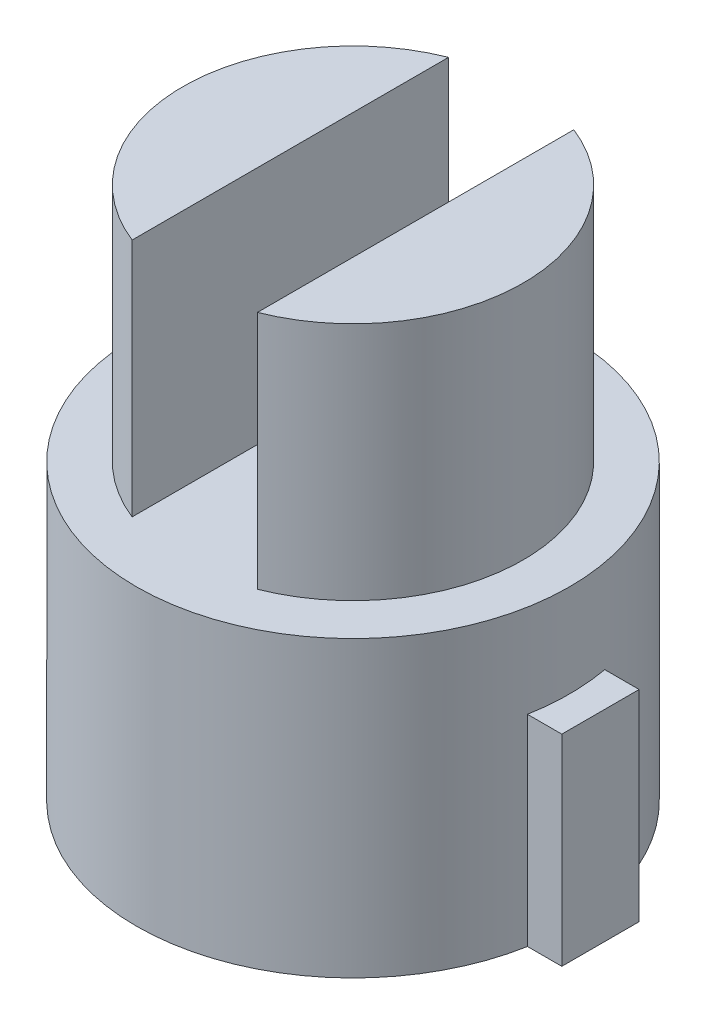
ISO-10303-21;
HEADER;
FILE_DESCRIPTION(('STEP AP214'),'2;1');
FILE_NAME('part.step','',(''),(''),'','','');
FILE_SCHEMA(('AUTOMOTIVE_DESIGN { 1 0 10303 214 1 1 1 1 }'));
ENDSEC;
DATA;
#1=APPLICATION_CONTEXT('core data for automotive mechanical design processes');
#2=APPLICATION_PROTOCOL_DEFINITION('international standard','automotive_design',2000,#1);
#3=PRODUCT_CONTEXT('',#1,'mechanical');
#4=PRODUCT('Part','Part','',(#3));
#5=PRODUCT_RELATED_PRODUCT_CATEGORY('part','',(#4));
#6=PRODUCT_DEFINITION_FORMATION('','',#4);
#7=PRODUCT_DEFINITION_CONTEXT('part definition',#1,'design');
#8=PRODUCT_DEFINITION('design','',#6,#7);
#9=PRODUCT_DEFINITION_SHAPE('','',#8);
#10=(LENGTH_UNIT() NAMED_UNIT(*) SI_UNIT(.MILLI.,.METRE.));
#11=(NAMED_UNIT(*) PLANE_ANGLE_UNIT() SI_UNIT($,.RADIAN.));
#12=(NAMED_UNIT(*) SI_UNIT($,.STERADIAN.) SOLID_ANGLE_UNIT());
#13=UNCERTAINTY_MEASURE_WITH_UNIT(LENGTH_MEASURE(1.E-05),#10,'distance_accuracy_value','');
#14=(GEOMETRIC_REPRESENTATION_CONTEXT(3) GLOBAL_UNCERTAINTY_ASSIGNED_CONTEXT((#13)) GLOBAL_UNIT_ASSIGNED_CONTEXT((#10,
#11,#12)) REPRESENTATION_CONTEXT('',''));
#15=CARTESIAN_POINT('',(0.,0.,0.));
#16=DIRECTION('',(0.,0.,1.));
#17=DIRECTION('',(1.,0.,0.));
#18=AXIS2_PLACEMENT_3D('',#15,#16,#17);
#19=CARTESIAN_POINT('',(0.,19.,0.));
#20=DIRECTION('',(0.,-1.,0.));
#21=DIRECTION('',(0.,0.,-1.));
#22=AXIS2_PLACEMENT_3D('',#19,#20,#21);
#23=CYLINDRICAL_SURFACE('',#22,14.);
#24=CARTESIAN_POINT('',(0.,19.,0.));
#25=DIRECTION('',(0.,1.,0.));
#26=DIRECTION('',(0.,0.,1.));
#27=AXIS2_PLACEMENT_3D('',#24,#25,#26);
#28=CIRCLE('',#27,14.);
#29=CARTESIAN_POINT('',(0.,19.,14.));
#30=VERTEX_POINT('',#29);
#31=EDGE_CURVE('E236',#30,#30,#28,.T.);
#32=ORIENTED_EDGE('',*,*,#31,.F.);
#33=EDGE_LOOP('',(#32));
#34=FACE_BOUND('',#33,.T.);
#35=DIRECTION('',(0.,-1.,0.));
#36=VECTOR('',#35,1.);
#37=CARTESIAN_POINT('',(13.7752957501457,13.,2.49824478304639));
#38=LINE('',#37,#36);
#39=CARTESIAN_POINT('',(13.7752957501457,13.,2.49824478304639));
#40=VERTEX_POINT('',#39);
#41=CARTESIAN_POINT('',(13.7752957501457,0.,2.49824478304639));
#42=VERTEX_POINT('',#41);
#43=EDGE_CURVE('E65',#40,#42,#38,.T.);
#44=ORIENTED_EDGE('',*,*,#43,.F.);
#45=CARTESIAN_POINT('',(0.,13.,0.));
#46=DIRECTION('',(0.,1.,0.));
#47=DIRECTION('',(0.,0.,1.));
#48=AXIS2_PLACEMENT_3D('',#45,#46,#47);
#49=CIRCLE('',#48,14.);
#50=CARTESIAN_POINT('',(13.7749773139559,13.,-2.5));
#51=VERTEX_POINT('',#50);
#52=EDGE_CURVE('E60',#40,#51,#49,.T.);
#53=ORIENTED_EDGE('',*,*,#52,.T.);
#54=DIRECTION('',(0.,-1.,0.));
#55=VECTOR('',#54,1.);
#56=CARTESIAN_POINT('',(13.7749773139559,13.,-2.5));
#57=LINE('',#56,#55);
#58=CARTESIAN_POINT('',(13.7749773139559,0.,-2.5));
#59=VERTEX_POINT('',#58);
#60=EDGE_CURVE('E173',#51,#59,#57,.T.);
#61=ORIENTED_EDGE('',*,*,#60,.T.);
#62=CARTESIAN_POINT('',(0.,0.,0.));
#63=DIRECTION('',(0.,1.,0.));
#64=DIRECTION('',(0.,0.,1.));
#65=AXIS2_PLACEMENT_3D('',#62,#63,#64);
#66=CIRCLE('',#65,14.);
#67=CARTESIAN_POINT('',(-13.7746586467486,0.,-2.50175521695361));
#68=VERTEX_POINT('',#67);
#69=EDGE_CURVE('E226',#59,#68,#66,.T.);
#70=ORIENTED_EDGE('',*,*,#69,.T.);
#71=DIRECTION('',(0.,-1.,0.));
#72=VECTOR('',#71,1.);
#73=CARTESIAN_POINT('',(-13.7746586467486,13.,-2.50175521695361));
#74=LINE('',#73,#72);
#75=CARTESIAN_POINT('',(-13.7746586467486,13.,-2.50175521695361));
#76=VERTEX_POINT('',#75);
#77=EDGE_CURVE('E212',#76,#68,#74,.T.);
#78=ORIENTED_EDGE('',*,*,#77,.F.);
#79=CARTESIAN_POINT('',(0.,13.,0.));
#80=DIRECTION('',(0.,1.,0.));
#81=DIRECTION('',(0.,0.,1.));
#82=AXIS2_PLACEMENT_3D('',#79,#80,#81);
#83=CIRCLE('',#82,14.);
#84=CARTESIAN_POINT('',(-13.7752957501457,13.,2.49824478304639));
#85=VERTEX_POINT('',#84);
#86=EDGE_CURVE('E187',#76,#85,#83,.T.);
#87=ORIENTED_EDGE('',*,*,#86,.T.);
#88=DIRECTION('',(0.,-1.,0.));
#89=VECTOR('',#88,1.);
#90=CARTESIAN_POINT('',(-13.7752957501457,13.,2.49824478304639));
#91=LINE('',#90,#89);
#92=CARTESIAN_POINT('',(-13.7752957501457,0.,2.49824478304639));
#93=VERTEX_POINT('',#92);
#94=EDGE_CURVE('E198',#85,#93,#91,.T.);
#95=ORIENTED_EDGE('',*,*,#94,.T.);
#96=EDGE_CURVE('E246',#93,#42,#66,.T.);
#97=ORIENTED_EDGE('',*,*,#96,.T.);
#98=EDGE_LOOP('',(#44,#53,#61,#70,#78,#87,#95,#97));
#99=FACE_BOUND('',#98,.T.);
#100=ADVANCED_FACE('F45',(#34,#99),#23,.T.);
#101=CARTESIAN_POINT('',(-4.05085374094877,34.5,0.));
#102=DIRECTION('',(1.,0.,0.));
#103=DIRECTION('',(0.,0.,-1.));
#104=AXIS2_PLACEMENT_3D('',#101,#102,#103);
#105=PLANE('',#104);
#106=DIRECTION('',(0.,0.,1.));
#107=VECTOR('',#106,1.);
#108=CARTESIAN_POINT('',(-4.05085374094877,19.,0.));
#109=LINE('',#108,#107);
#110=CARTESIAN_POINT('',(-4.05085374094877,19.,-10.2269534886764));
#111=VERTEX_POINT('',#110);
#112=CARTESIAN_POINT('',(-4.05085374094877,19.,10.2201362771462));
#113=VERTEX_POINT('',#112);
#114=EDGE_CURVE('E240',#111,#113,#109,.T.);
#115=ORIENTED_EDGE('',*,*,#114,.F.);
#116=DIRECTION('',(0.,-1.,0.));
#117=VECTOR('',#116,1.);
#118=CARTESIAN_POINT('',(-4.05085374094877,34.5,-10.2269534886764));
#119=LINE('',#118,#117);
#120=CARTESIAN_POINT('',(-4.05085374094877,34.5,-10.2269534886764));
#121=VERTEX_POINT('',#120);
#122=EDGE_CURVE('E11',#121,#111,#119,.T.);
#123=ORIENTED_EDGE('',*,*,#122,.F.);
#124=DIRECTION('',(0.,0.,1.));
#125=VECTOR('',#124,1.);
#126=CARTESIAN_POINT('',(-4.05085374094877,34.5,0.));
#127=LINE('',#126,#125);
#128=CARTESIAN_POINT('',(-4.05085374094877,34.5,10.2201362771462));
#129=VERTEX_POINT('',#128);
#130=EDGE_CURVE('E258',#121,#129,#127,.T.);
#131=ORIENTED_EDGE('',*,*,#130,.T.);
#132=DIRECTION('',(0.,-1.,0.));
#133=VECTOR('',#132,1.);
#134=CARTESIAN_POINT('',(-4.05085374094877,34.5,10.2201362771462));
#135=LINE('',#134,#133);
#136=EDGE_CURVE('E266',#129,#113,#135,.T.);
#137=ORIENTED_EDGE('',*,*,#136,.T.);
#138=EDGE_LOOP('',(#115,#123,#131,#137));
#139=FACE_BOUND('',#138,.T.);
#140=ADVANCED_FACE('F47',(#139),#105,.T.);
#141=CARTESIAN_POINT('',(0.,34.5,0.));
#142=DIRECTION('',(0.,-1.,0.));
#143=DIRECTION('',(0.,0.,-1.));
#144=AXIS2_PLACEMENT_3D('',#141,#142,#143);
#145=CYLINDRICAL_SURFACE('',#144,10.9999997131868);
#146=ORIENTED_EDGE('',*,*,#122,.T.);
#147=CARTESIAN_POINT('',(0.,19.,0.));
#148=DIRECTION('',(0.,1.,0.));
#149=DIRECTION('',(0.,0.,1.));
#150=AXIS2_PLACEMENT_3D('',#147,#148,#149);
#151=CIRCLE('',#150,10.9999997131868);
#152=CARTESIAN_POINT('',(-4.05318905300909,19.,10.2260281727891));
#153=VERTEX_POINT('',#152);
#154=EDGE_CURVE('E233',#111,#153,#151,.T.);
#155=ORIENTED_EDGE('',*,*,#154,.T.);
#156=DIRECTION('',(0.,-1.,0.));
#157=VECTOR('',#156,1.);
#158=CARTESIAN_POINT('',(-4.05318905300909,34.5,10.2260281727891));
#159=LINE('',#158,#157);
#160=CARTESIAN_POINT('',(-4.05318905300909,34.5,10.2260281727891));
#161=VERTEX_POINT('',#160);
#162=EDGE_CURVE('E53',#161,#153,#159,.T.);
#163=ORIENTED_EDGE('',*,*,#162,.F.);
#164=CARTESIAN_POINT('',(0.,34.5,0.));
#165=DIRECTION('',(0.,1.,0.));
#166=DIRECTION('',(0.,0.,1.));
#167=AXIS2_PLACEMENT_3D('',#164,#165,#166);
#168=CIRCLE('',#167,10.9999997131868);
#169=EDGE_CURVE('E261',#121,#161,#168,.T.);
#170=ORIENTED_EDGE('',*,*,#169,.F.);
#171=EDGE_LOOP('',(#146,#155,#163,#170));
#172=FACE_BOUND('',#171,.T.);
#173=ADVANCED_FACE('F287',(#172),#145,.T.);
#174=CARTESIAN_POINT('',(-6.49904603158947E-13,34.5,-2.57596221965533E-13));
#175=DIRECTION('',(0.929638949038373,0.,0.368471741699183));
#176=DIRECTION('',(0.368471741699183,0.,-0.929638949038373));
#177=AXIS2_PLACEMENT_3D('',#174,#175,#176);
#178=PLANE('',#177);
#179=DIRECTION('',(-0.368471741699183,0.,0.929638949038373));
#180=VECTOR('',#179,1.);
#181=CARTESIAN_POINT('',(-6.49904603158947E-13,0.,-2.57596221965533E-13));
#182=LINE('',#181,#180);
#183=CARTESIAN_POINT('',(-4.05085374094877,0.,10.2201362771462));
#184=VERTEX_POINT('',#183);
#185=CARTESIAN_POINT('',(-4.05318905300909,0.,10.2260281727891));
#186=VERTEX_POINT('',#185);
#187=EDGE_CURVE('E257',#184,#186,#182,.T.);
#188=ORIENTED_EDGE('',*,*,#187,.F.);
#189=DIRECTION('',(0.,1.,0.));
#190=VECTOR('',#189,1.);
#191=CARTESIAN_POINT('',(-4.05085374094877,34.5,10.2201362771462));
#192=LINE('',#191,#190);
#193=EDGE_CURVE('E255',#184,#113,#192,.T.);
#194=ORIENTED_EDGE('',*,*,#193,.T.);
#195=ORIENTED_EDGE('',*,*,#136,.F.);
#196=DIRECTION('',(-0.368471741699183,0.,0.929638949038373));
#197=VECTOR('',#196,1.);
#198=CARTESIAN_POINT('',(-6.49904603158947E-13,34.5,-2.57596221965533E-13));
#199=LINE('',#198,#197);
#200=EDGE_CURVE('E263',#129,#161,#199,.T.);
#201=ORIENTED_EDGE('',*,*,#200,.T.);
#202=ORIENTED_EDGE('',*,*,#162,.T.);
#203=DIRECTION('',(0.,-1.,0.));
#204=VECTOR('',#203,1.);
#205=CARTESIAN_POINT('',(-4.05318905300909,19.,10.2260281727891));
#206=LINE('',#205,#204);
#207=EDGE_CURVE('E252',#186,#153,#206,.F.);
#208=ORIENTED_EDGE('',*,*,#207,.F.);
#209=EDGE_LOOP('',(#188,#194,#195,#201,#202,#208));
#210=FACE_BOUND('',#209,.T.);
#211=ADVANCED_FACE('F273',(#210),#178,.T.);
#212=CARTESIAN_POINT('',(0.,34.5,0.));
#213=DIRECTION('',(0.,1.,0.));
#214=DIRECTION('',(0.,0.,1.));
#215=AXIS2_PLACEMENT_3D('',#212,#213,#214);
#216=PLANE('',#215);
#217=ORIENTED_EDGE('',*,*,#130,.F.);
#218=ORIENTED_EDGE('',*,*,#169,.T.);
#219=ORIENTED_EDGE('',*,*,#200,.F.);
#220=EDGE_LOOP('',(#217,#218,#219));
#221=FACE_BOUND('',#220,.T.);
#222=ADVANCED_FACE('F298',(#221),#216,.T.);
#223=CARTESIAN_POINT('',(0.,0.,0.));
#224=DIRECTION('',(0.,1.,0.));
#225=DIRECTION('',(0.,0.,1.));
#226=AXIS2_PLACEMENT_3D('',#223,#224,#225);
#227=PLANE('',#226);
#228=DIRECTION('',(0.,0.,1.));
#229=VECTOR('',#228,1.);
#230=CARTESIAN_POINT('',(-4.05085374094877,0.,0.));
#231=LINE('',#230,#229);
#232=CARTESIAN_POINT('',(-4.05085374094877,0.,10.2269534886764));
#233=VERTEX_POINT('',#232);
#234=EDGE_CURVE('E245',#184,#233,#231,.T.);
#235=ORIENTED_EDGE('',*,*,#234,.F.);
#236=ORIENTED_EDGE('',*,*,#187,.T.);
#237=CARTESIAN_POINT('',(0.,0.,0.));
#238=DIRECTION('',(0.,1.,0.));
#239=DIRECTION('',(0.,0.,1.));
#240=AXIS2_PLACEMENT_3D('',#237,#238,#239);
#241=CIRCLE('',#240,10.9999997131868);
#242=EDGE_CURVE('E231',#186,#233,#241,.T.);
#243=ORIENTED_EDGE('',*,*,#242,.T.);
#244=EDGE_LOOP('',(#235,#236,#243));
#245=FACE_BOUND('',#244,.T.);
#246=ORIENTED_EDGE('',*,*,#96,.F.);
#247=DIRECTION('',(-1.,0.,0.));
#248=VECTOR('',#247,1.);
#249=CARTESIAN_POINT('',(0.,0.,2.49824478304639));
#250=LINE('',#249,#248);
#251=CARTESIAN_POINT('',(-16.,0.,2.49824478304639));
#252=VERTEX_POINT('',#251);
#253=EDGE_CURVE('E190',#93,#252,#250,.T.);
#254=ORIENTED_EDGE('',*,*,#253,.T.);
#255=DIRECTION('',(0.,0.,-1.));
#256=VECTOR('',#255,1.);
#257=CARTESIAN_POINT('',(-16.,0.,0.));
#258=LINE('',#257,#256);
#259=CARTESIAN_POINT('',(-16.,0.,-2.50175521695361));
#260=VERTEX_POINT('',#259);
#261=EDGE_CURVE('E201',#252,#260,#258,.T.);
#262=ORIENTED_EDGE('',*,*,#261,.T.);
#263=DIRECTION('',(-1.,0.,0.));
#264=VECTOR('',#263,1.);
#265=CARTESIAN_POINT('',(0.,0.,-2.50175521695361));
#266=LINE('',#265,#264);
#267=EDGE_CURVE('E186',#68,#260,#266,.T.);
#268=ORIENTED_EDGE('',*,*,#267,.F.);
#269=ORIENTED_EDGE('',*,*,#69,.F.);
#270=DIRECTION('',(1.,0.,0.));
#271=VECTOR('',#270,1.);
#272=CARTESIAN_POINT('',(0.,0.,-2.5));
#273=LINE('',#272,#271);
#274=CARTESIAN_POINT('',(15.9953222609992,0.,-2.5));
#275=VERTEX_POINT('',#274);
#276=EDGE_CURVE('E180',#59,#275,#273,.T.);
#277=ORIENTED_EDGE('',*,*,#276,.T.);
#278=DIRECTION('',(0.,0.,-1.));
#279=VECTOR('',#278,1.);
#280=CARTESIAN_POINT('',(15.9953222609992,0.,0.));
#281=LINE('',#280,#279);
#282=CARTESIAN_POINT('',(15.9953222609992,0.,2.49824478304639));
#283=VERTEX_POINT('',#282);
#284=EDGE_CURVE('E178',#283,#275,#281,.T.);
#285=ORIENTED_EDGE('',*,*,#284,.F.);
#286=DIRECTION('',(1.,0.,0.));
#287=VECTOR('',#286,1.);
#288=CARTESIAN_POINT('',(0.,0.,2.49824478304639));
#289=LINE('',#288,#287);
#290=EDGE_CURVE('E163',#42,#283,#289,.T.);
#291=ORIENTED_EDGE('',*,*,#290,.F.);
#292=EDGE_LOOP('',(#246,#254,#262,#268,#269,#277,#285,#291));
#293=FACE_BOUND('',#292,.T.);
#294=ADVANCED_FACE('F295',(#245,#293),#227,.F.);
#295=CARTESIAN_POINT('',(-4.05085374094877,19.,0.));
#296=DIRECTION('',(1.,0.,0.));
#297=DIRECTION('',(0.,0.,-1.));
#298=AXIS2_PLACEMENT_3D('',#295,#296,#297);
#299=PLANE('',#298);
#300=ORIENTED_EDGE('',*,*,#193,.F.);
#301=ORIENTED_EDGE('',*,*,#234,.T.);
#302=DIRECTION('',(0.,-1.,0.));
#303=VECTOR('',#302,1.);
#304=CARTESIAN_POINT('',(-4.05085374094877,19.,10.2269534886764));
#305=LINE('',#304,#303);
#306=CARTESIAN_POINT('',(-4.05085374094877,19.,10.2269534886764));
#307=VERTEX_POINT('',#306);
#308=EDGE_CURVE('E249',#307,#233,#305,.T.);
#309=ORIENTED_EDGE('',*,*,#308,.F.);
#310=EDGE_CURVE('E239',#113,#307,#109,.T.);
#311=ORIENTED_EDGE('',*,*,#310,.F.);
#312=EDGE_LOOP('',(#300,#301,#309,#311));
#313=FACE_BOUND('',#312,.T.);
#314=ADVANCED_FACE('F292',(#313),#299,.F.);
#315=CARTESIAN_POINT('',(0.,19.,0.));
#316=DIRECTION('',(0.,-1.,0.));
#317=DIRECTION('',(0.,0.,-1.));
#318=AXIS2_PLACEMENT_3D('',#315,#316,#317);
#319=CYLINDRICAL_SURFACE('',#318,10.9999997131868);
#320=ORIENTED_EDGE('',*,*,#242,.F.);
#321=ORIENTED_EDGE('',*,*,#207,.T.);
#322=EDGE_CURVE('E232',#153,#307,#151,.T.);
#323=ORIENTED_EDGE('',*,*,#322,.T.);
#324=ORIENTED_EDGE('',*,*,#308,.T.);
#325=EDGE_LOOP('',(#320,#321,#323,#324));
#326=FACE_BOUND('',#325,.T.);
#327=ADVANCED_FACE('F281',(#326),#319,.F.);
#328=CARTESIAN_POINT('',(0.,19.,0.));
#329=DIRECTION('',(0.,1.,0.));
#330=DIRECTION('',(0.,0.,1.));
#331=AXIS2_PLACEMENT_3D('',#328,#329,#330);
#332=PLANE('',#331);
#333=CARTESIAN_POINT('',(4.05085374094877,19.,10.2269534886764));
#334=VERTEX_POINT('',#333);
#335=CARTESIAN_POINT('',(4.05085374094877,19.,-10.2269534886764));
#336=VERTEX_POINT('',#335);
#337=EDGE_CURVE('E227',#334,#336,#151,.T.);
#338=ORIENTED_EDGE('',*,*,#337,.F.);
#339=DIRECTION('',(0.,0.,1.));
#340=VECTOR('',#339,1.);
#341=CARTESIAN_POINT('',(4.05085374094877,19.,0.));
#342=LINE('',#341,#340);
#343=EDGE_CURVE('E230',#336,#334,#342,.T.);
#344=ORIENTED_EDGE('',*,*,#343,.F.);
#345=EDGE_LOOP('',(#338,#344));
#346=FACE_BOUND('',#345,.T.);
#347=ORIENTED_EDGE('',*,*,#31,.T.);
#348=EDGE_LOOP('',(#347));
#349=FACE_BOUND('',#348,.T.);
#350=ORIENTED_EDGE('',*,*,#114,.T.);
#351=ORIENTED_EDGE('',*,*,#310,.T.);
#352=ORIENTED_EDGE('',*,*,#322,.F.);
#353=ORIENTED_EDGE('',*,*,#154,.F.);
#354=EDGE_LOOP('',(#350,#351,#352,#353));
#355=FACE_BOUND('',#354,.T.);
#356=ADVANCED_FACE('F285',(#346,#349,#355),#332,.T.);
#357=CARTESIAN_POINT('',(0.,34.5,0.));
#358=DIRECTION('',(0.,1.,0.));
#359=DIRECTION('',(0.,0.,1.));
#360=AXIS2_PLACEMENT_3D('',#357,#358,#359);
#361=PLANE('',#360);
#362=DIRECTION('',(0.,0.,1.));
#363=VECTOR('',#362,1.);
#364=CARTESIAN_POINT('',(4.05085374094877,34.5,0.));
#365=LINE('',#364,#363);
#366=CARTESIAN_POINT('',(4.05085374094877,34.5,-10.2269534886764));
#367=VERTEX_POINT('',#366);
#368=CARTESIAN_POINT('',(4.05085374094877,34.5,10.2269534886764));
#369=VERTEX_POINT('',#368);
#370=EDGE_CURVE('E215',#367,#369,#365,.T.);
#371=ORIENTED_EDGE('',*,*,#370,.T.);
#372=CARTESIAN_POINT('',(0.,34.5,0.));
#373=DIRECTION('',(0.,1.,0.));
#374=DIRECTION('',(0.,0.,1.));
#375=AXIS2_PLACEMENT_3D('',#372,#373,#374);
#376=CIRCLE('',#375,10.9999997131868);
#377=EDGE_CURVE('E218',#369,#367,#376,.T.);
#378=ORIENTED_EDGE('',*,*,#377,.T.);
#379=EDGE_LOOP('',(#371,#378));
#380=FACE_BOUND('',#379,.T.);
#381=ADVANCED_FACE('F374',(#380),#361,.T.);
#382=CARTESIAN_POINT('',(0.,34.5,0.));
#383=DIRECTION('',(0.,-1.,0.));
#384=DIRECTION('',(0.,0.,-1.));
#385=AXIS2_PLACEMENT_3D('',#382,#383,#384);
#386=CYLINDRICAL_SURFACE('',#385,10.9999997131868);
#387=ORIENTED_EDGE('',*,*,#337,.T.);
#388=DIRECTION('',(0.,-1.,0.));
#389=VECTOR('',#388,1.);
#390=CARTESIAN_POINT('',(4.05085374094877,34.5,-10.2269534886764));
#391=LINE('',#390,#389);
#392=EDGE_CURVE('E220',#367,#336,#391,.T.);
#393=ORIENTED_EDGE('',*,*,#392,.F.);
#394=ORIENTED_EDGE('',*,*,#377,.F.);
#395=DIRECTION('',(0.,-1.,0.));
#396=VECTOR('',#395,1.);
#397=CARTESIAN_POINT('',(4.05085374094877,34.5,10.2269534886764));
#398=LINE('',#397,#396);
#399=EDGE_CURVE('E223',#369,#334,#398,.T.);
#400=ORIENTED_EDGE('',*,*,#399,.T.);
#401=EDGE_LOOP('',(#387,#393,#394,#400));
#402=FACE_BOUND('',#401,.T.);
#403=ADVANCED_FACE('F382',(#402),#386,.T.);
#404=CARTESIAN_POINT('',(4.05085374094877,34.5,0.));
#405=DIRECTION('',(1.,0.,0.));
#406=DIRECTION('',(0.,0.,-1.));
#407=AXIS2_PLACEMENT_3D('',#404,#405,#406);
#408=PLANE('',#407);
#409=ORIENTED_EDGE('',*,*,#343,.T.);
#410=ORIENTED_EDGE('',*,*,#399,.F.);
#411=ORIENTED_EDGE('',*,*,#370,.F.);
#412=ORIENTED_EDGE('',*,*,#392,.T.);
#413=EDGE_LOOP('',(#409,#410,#411,#412));
#414=FACE_BOUND('',#413,.T.);
#415=ADVANCED_FACE('F390',(#414),#408,.F.);
#416=CARTESIAN_POINT('',(0.,13.,-2.50175521695361));
#417=DIRECTION('',(0.,0.,1.));
#418=DIRECTION('',(1.,0.,0.));
#419=AXIS2_PLACEMENT_3D('',#416,#417,#418);
#420=PLANE('',#419);
#421=ORIENTED_EDGE('',*,*,#267,.T.);
#422=DIRECTION('',(0.,-1.,0.));
#423=VECTOR('',#422,1.);
#424=CARTESIAN_POINT('',(-16.,13.,-2.50175521695361));
#425=LINE('',#424,#423);
#426=CARTESIAN_POINT('',(-16.,13.,-2.50175521695361));
#427=VERTEX_POINT('',#426);
#428=EDGE_CURVE('E210',#427,#260,#425,.T.);
#429=ORIENTED_EDGE('',*,*,#428,.F.);
#430=DIRECTION('',(-1.,0.,0.));
#431=VECTOR('',#430,1.);
#432=CARTESIAN_POINT('',(0.,13.,-2.50175521695361));
#433=LINE('',#432,#431);
#434=EDGE_CURVE('E189',#76,#427,#433,.T.);
#435=ORIENTED_EDGE('',*,*,#434,.F.);
#436=ORIENTED_EDGE('',*,*,#77,.T.);
#437=EDGE_LOOP('',(#421,#429,#435,#436));
#438=FACE_BOUND('',#437,.T.);
#439=ADVANCED_FACE('F313',(#438),#420,.F.);
#440=CARTESIAN_POINT('',(-16.,13.,0.));
#441=DIRECTION('',(-1.,0.,0.));
#442=DIRECTION('',(0.,0.,1.));
#443=AXIS2_PLACEMENT_3D('',#440,#441,#442);
#444=PLANE('',#443);
#445=ORIENTED_EDGE('',*,*,#261,.F.);
#446=DIRECTION('',(0.,-1.,0.));
#447=VECTOR('',#446,1.);
#448=CARTESIAN_POINT('',(-16.,13.,2.49824478304639));
#449=LINE('',#448,#447);
#450=CARTESIAN_POINT('',(-16.,13.,2.49824478304639));
#451=VERTEX_POINT('',#450);
#452=EDGE_CURVE('E208',#451,#252,#449,.T.);
#453=ORIENTED_EDGE('',*,*,#452,.F.);
#454=DIRECTION('',(0.,0.,-1.));
#455=VECTOR('',#454,1.);
#456=CARTESIAN_POINT('',(-16.,13.,0.));
#457=LINE('',#456,#455);
#458=EDGE_CURVE('E192',#451,#427,#457,.T.);
#459=ORIENTED_EDGE('',*,*,#458,.T.);
#460=ORIENTED_EDGE('',*,*,#428,.T.);
#461=EDGE_LOOP('',(#445,#453,#459,#460));
#462=FACE_BOUND('',#461,.T.);
#463=ADVANCED_FACE('F309',(#462),#444,.T.);
#464=CARTESIAN_POINT('',(0.,13.,2.49824478304639));
#465=DIRECTION('',(0.,0.,1.));
#466=DIRECTION('',(1.,0.,0.));
#467=AXIS2_PLACEMENT_3D('',#464,#465,#466);
#468=PLANE('',#467);
#469=ORIENTED_EDGE('',*,*,#253,.F.);
#470=ORIENTED_EDGE('',*,*,#94,.F.);
#471=DIRECTION('',(-1.,0.,0.));
#472=VECTOR('',#471,1.);
#473=CARTESIAN_POINT('',(0.,13.,2.49824478304639));
#474=LINE('',#473,#472);
#475=EDGE_CURVE('E195',#85,#451,#474,.T.);
#476=ORIENTED_EDGE('',*,*,#475,.T.);
#477=ORIENTED_EDGE('',*,*,#452,.T.);
#478=EDGE_LOOP('',(#469,#470,#476,#477));
#479=FACE_BOUND('',#478,.T.);
#480=ADVANCED_FACE('F305',(#479),#468,.T.);
#481=CARTESIAN_POINT('',(0.,13.,0.));
#482=DIRECTION('',(0.,1.,0.));
#483=DIRECTION('',(0.,0.,1.));
#484=AXIS2_PLACEMENT_3D('',#481,#482,#483);
#485=PLANE('',#484);
#486=ORIENTED_EDGE('',*,*,#86,.F.);
#487=ORIENTED_EDGE('',*,*,#434,.T.);
#488=ORIENTED_EDGE('',*,*,#458,.F.);
#489=ORIENTED_EDGE('',*,*,#475,.F.);
#490=EDGE_LOOP('',(#486,#487,#488,#489));
#491=FACE_BOUND('',#490,.T.);
#492=ADVANCED_FACE('F416',(#491),#485,.T.);
#493=CARTESIAN_POINT('',(0.,13.,2.49824478304639));
#494=DIRECTION('',(0.,0.,-1.));
#495=DIRECTION('',(-1.,0.,0.));
#496=AXIS2_PLACEMENT_3D('',#493,#494,#495);
#497=PLANE('',#496);
#498=ORIENTED_EDGE('',*,*,#290,.T.);
#499=DIRECTION('',(0.,-1.,0.));
#500=VECTOR('',#499,1.);
#501=CARTESIAN_POINT('',(15.9953222609992,13.,2.49824478304639));
#502=LINE('',#501,#500);
#503=CARTESIAN_POINT('',(15.9953222609992,13.,2.49824478304639));
#504=VERTEX_POINT('',#503);
#505=EDGE_CURVE('E160',#504,#283,#502,.T.);
#506=ORIENTED_EDGE('',*,*,#505,.F.);
#507=DIRECTION('',(1.,0.,0.));
#508=VECTOR('',#507,1.);
#509=CARTESIAN_POINT('',(0.,13.,2.49824478304639));
#510=LINE('',#509,#508);
#511=EDGE_CURVE('E150',#40,#504,#510,.T.);
#512=ORIENTED_EDGE('',*,*,#511,.F.);
#513=ORIENTED_EDGE('',*,*,#43,.T.);
#514=EDGE_LOOP('',(#498,#506,#512,#513));
#515=FACE_BOUND('',#514,.T.);
#516=ADVANCED_FACE('F161',(#515),#497,.F.);
#517=CARTESIAN_POINT('',(15.9953222609992,13.,0.));
#518=DIRECTION('',(-1.,0.,0.));
#519=DIRECTION('',(0.,0.,1.));
#520=AXIS2_PLACEMENT_3D('',#517,#518,#519);
#521=PLANE('',#520);
#522=ORIENTED_EDGE('',*,*,#284,.T.);
#523=DIRECTION('',(0.,-1.,0.));
#524=VECTOR('',#523,1.);
#525=CARTESIAN_POINT('',(15.9953222609992,13.,-2.5));
#526=LINE('',#525,#524);
#527=CARTESIAN_POINT('',(15.9953222609992,13.,-2.5));
#528=VERTEX_POINT('',#527);
#529=EDGE_CURVE('E167',#528,#275,#526,.T.);
#530=ORIENTED_EDGE('',*,*,#529,.F.);
#531=DIRECTION('',(0.,0.,-1.));
#532=VECTOR('',#531,1.);
#533=CARTESIAN_POINT('',(15.9953222609992,13.,0.));
#534=LINE('',#533,#532);
#535=EDGE_CURVE('E155',#504,#528,#534,.T.);
#536=ORIENTED_EDGE('',*,*,#535,.F.);
#537=ORIENTED_EDGE('',*,*,#505,.T.);
#538=EDGE_LOOP('',(#522,#530,#536,#537));
#539=FACE_BOUND('',#538,.T.);
#540=ADVANCED_FACE('F169',(#539),#521,.F.);
#541=CARTESIAN_POINT('',(0.,13.,-2.5));
#542=DIRECTION('',(0.,0.,-1.));
#543=DIRECTION('',(-1.,0.,0.));
#544=AXIS2_PLACEMENT_3D('',#541,#542,#543);
#545=PLANE('',#544);
#546=ORIENTED_EDGE('',*,*,#276,.F.);
#547=ORIENTED_EDGE('',*,*,#60,.F.);
#548=DIRECTION('',(1.,0.,0.));
#549=VECTOR('',#548,1.);
#550=CARTESIAN_POINT('',(0.,13.,-2.5));
#551=LINE('',#550,#549);
#552=EDGE_CURVE('E171',#51,#528,#551,.T.);
#553=ORIENTED_EDGE('',*,*,#552,.T.);
#554=ORIENTED_EDGE('',*,*,#529,.T.);
#555=EDGE_LOOP('',(#546,#547,#553,#554));
#556=FACE_BOUND('',#555,.T.);
#557=ADVANCED_FACE('F317',(#556),#545,.T.);
#558=CARTESIAN_POINT('',(0.,13.,0.));
#559=DIRECTION('',(0.,1.,0.));
#560=DIRECTION('',(0.,0.,1.));
#561=AXIS2_PLACEMENT_3D('',#558,#559,#560);
#562=PLANE('',#561);
#563=ORIENTED_EDGE('',*,*,#52,.F.);
#564=ORIENTED_EDGE('',*,*,#511,.T.);
#565=ORIENTED_EDGE('',*,*,#535,.T.);
#566=ORIENTED_EDGE('',*,*,#552,.F.);
#567=EDGE_LOOP('',(#563,#564,#565,#566));
#568=FACE_BOUND('',#567,.T.);
#569=ADVANCED_FACE('F152',(#568),#562,.T.);
#570=CLOSED_SHELL('',(#100,#140,#173,#211,#222,#294,#314,#327,#356,#381,#403,#415,#439,#463,
#480,#492,#516,#540,#557,#569));
#571=MANIFOLD_SOLID_BREP('B2',#570);
#572=ADVANCED_BREP_SHAPE_REPRESENTATION('',(#18,#571),#14);
#573=SHAPE_DEFINITION_REPRESENTATION(#9,#572);
ENDSEC;
END-ISO-10303-21;
